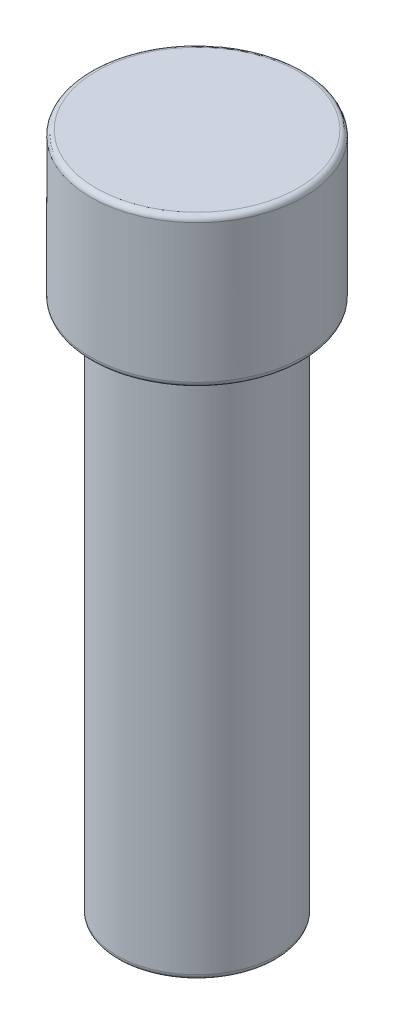
ISO-10303-21;
HEADER;
FILE_DESCRIPTION(('STEP AP214'),'2;1');
FILE_NAME('part.step','',(''),(''),'','','');
FILE_SCHEMA(('AUTOMOTIVE_DESIGN { 1 0 10303 214 1 1 1 1 }'));
ENDSEC;
DATA;
#1=APPLICATION_CONTEXT('core data for automotive mechanical design processes');
#2=APPLICATION_PROTOCOL_DEFINITION('international standard','automotive_design',2000,#1);
#3=PRODUCT_CONTEXT('',#1,'mechanical');
#4=PRODUCT('Part','Part','',(#3));
#5=PRODUCT_RELATED_PRODUCT_CATEGORY('part','',(#4));
#6=PRODUCT_DEFINITION_FORMATION('','',#4);
#7=PRODUCT_DEFINITION_CONTEXT('part definition',#1,'design');
#8=PRODUCT_DEFINITION('design','',#6,#7);
#9=PRODUCT_DEFINITION_SHAPE('','',#8);
#10=(LENGTH_UNIT() NAMED_UNIT(*) SI_UNIT(.MILLI.,.METRE.));
#11=(NAMED_UNIT(*) PLANE_ANGLE_UNIT() SI_UNIT($,.RADIAN.));
#12=(NAMED_UNIT(*) SI_UNIT($,.STERADIAN.) SOLID_ANGLE_UNIT());
#13=UNCERTAINTY_MEASURE_WITH_UNIT(LENGTH_MEASURE(1.E-05),#10,'distance_accuracy_value','');
#14=(GEOMETRIC_REPRESENTATION_CONTEXT(3) GLOBAL_UNCERTAINTY_ASSIGNED_CONTEXT((#13)) GLOBAL_UNIT_ASSIGNED_CONTEXT((#10,
#11,#12)) REPRESENTATION_CONTEXT('',''));
#15=CARTESIAN_POINT('',(0.,0.,0.));
#16=DIRECTION('',(0.,0.,1.));
#17=DIRECTION('',(1.,0.,0.));
#18=AXIS2_PLACEMENT_3D('',#15,#16,#17);
#19=CARTESIAN_POINT('',(0.,25.6,0.));
#20=DIRECTION('',(0.,1.,0.));
#21=DIRECTION('',(0.,0.,1.));
#22=AXIS2_PLACEMENT_3D('',#19,#20,#21);
#23=PLANE('',#22);
#24=CARTESIAN_POINT('',(0.,25.6,0.));
#25=DIRECTION('',(0.,1.,0.));
#26=DIRECTION('',(0.,0.,1.));
#27=AXIS2_PLACEMENT_3D('',#24,#25,#26);
#28=CIRCLE('',#27,3.8);
#29=CARTESIAN_POINT('',(0.,25.6,3.8));
#30=VERTEX_POINT('',#29);
#31=EDGE_CURVE('E11',#30,#30,#28,.T.);
#32=ORIENTED_EDGE('',*,*,#31,.T.);
#33=EDGE_LOOP('',(#32));
#34=FACE_BOUND('',#33,.T.);
#35=ADVANCED_FACE('F37',(#34),#23,.T.);
#36=CARTESIAN_POINT('',(0.,0.,0.));
#37=DIRECTION('',(0.,-1.,0.));
#38=DIRECTION('',(0.,0.,-1.));
#39=AXIS2_PLACEMENT_3D('',#36,#37,#38);
#40=CYLINDRICAL_SURFACE('',#39,4.);
#41=CARTESIAN_POINT('',(0.,20.2,0.));
#42=DIRECTION('',(0.,-1.,0.));
#43=DIRECTION('',(0.,0.,-1.));
#44=AXIS2_PLACEMENT_3D('',#41,#42,#43);
#45=CIRCLE('',#44,4.);
#46=CARTESIAN_POINT('',(0.,20.2,-4.));
#47=VERTEX_POINT('',#46);
#48=EDGE_CURVE('E71',#47,#47,#45,.F.);
#49=ORIENTED_EDGE('',*,*,#48,.T.);
#50=EDGE_LOOP('',(#49));
#51=FACE_BOUND('',#50,.T.);
#52=CARTESIAN_POINT('',(0.,25.4,0.));
#53=DIRECTION('',(0.,1.,0.));
#54=DIRECTION('',(0.,0.,1.));
#55=AXIS2_PLACEMENT_3D('',#52,#53,#54);
#56=CIRCLE('',#55,4.);
#57=CARTESIAN_POINT('',(0.,25.4,4.));
#58=VERTEX_POINT('',#57);
#59=EDGE_CURVE('E68',#58,#58,#56,.F.);
#60=ORIENTED_EDGE('',*,*,#59,.T.);
#61=EDGE_LOOP('',(#60));
#62=FACE_BOUND('',#61,.T.);
#63=ADVANCED_FACE('F101',(#51,#62),#40,.T.);
#64=CARTESIAN_POINT('',(4.,20.,0.));
#65=DIRECTION('',(0.,-1.,0.));
#66=DIRECTION('',(0.,0.,-1.));
#67=AXIS2_PLACEMENT_3D('',#64,#65,#66);
#68=PLANE('',#67);
#69=CARTESIAN_POINT('',(0.,20.,0.));
#70=DIRECTION('',(0.,-1.,0.));
#71=DIRECTION('',(0.,0.,-1.));
#72=AXIS2_PLACEMENT_3D('',#69,#70,#71);
#73=CIRCLE('',#72,3.8);
#74=CARTESIAN_POINT('',(0.,20.,-3.8));
#75=VERTEX_POINT('',#74);
#76=EDGE_CURVE('E61',#75,#75,#73,.T.);
#77=ORIENTED_EDGE('',*,*,#76,.T.);
#78=EDGE_LOOP('',(#77));
#79=FACE_BOUND('',#78,.T.);
#80=CARTESIAN_POINT('',(0.,20.,0.));
#81=DIRECTION('',(0.,-1.,0.));
#82=DIRECTION('',(0.,0.,-1.));
#83=AXIS2_PLACEMENT_3D('',#80,#81,#82);
#84=CIRCLE('',#83,3.);
#85=CARTESIAN_POINT('',(0.,20.,-3.));
#86=VERTEX_POINT('',#85);
#87=EDGE_CURVE('E57',#86,#86,#84,.T.);
#88=ORIENTED_EDGE('',*,*,#87,.F.);
#89=EDGE_LOOP('',(#88));
#90=FACE_BOUND('',#89,.T.);
#91=ADVANCED_FACE('F107',(#79,#90),#68,.T.);
#92=CARTESIAN_POINT('',(0.,0.,0.));
#93=DIRECTION('',(0.,-1.,0.));
#94=DIRECTION('',(0.,0.,-1.));
#95=AXIS2_PLACEMENT_3D('',#92,#93,#94);
#96=CYLINDRICAL_SURFACE('',#95,3.);
#97=CARTESIAN_POINT('',(0.,0.2,0.));
#98=DIRECTION('',(0.,-1.,0.));
#99=DIRECTION('',(0.,0.,-1.));
#100=AXIS2_PLACEMENT_3D('',#97,#98,#99);
#101=CIRCLE('',#100,3.);
#102=CARTESIAN_POINT('',(0.,0.2,-3.));
#103=VERTEX_POINT('',#102);
#104=EDGE_CURVE('E44',#103,#103,#101,.F.);
#105=ORIENTED_EDGE('',*,*,#104,.T.);
#106=EDGE_LOOP('',(#105));
#107=FACE_BOUND('',#106,.T.);
#108=ORIENTED_EDGE('',*,*,#87,.T.);
#109=EDGE_LOOP('',(#108));
#110=FACE_BOUND('',#109,.T.);
#111=ADVANCED_FACE('F79',(#107,#110),#96,.T.);
#112=CARTESIAN_POINT('',(3.,0.,0.));
#113=DIRECTION('',(0.,-1.,0.));
#114=DIRECTION('',(0.,0.,-1.));
#115=AXIS2_PLACEMENT_3D('',#112,#113,#114);
#116=PLANE('',#115);
#117=CARTESIAN_POINT('',(0.,0.,0.));
#118=DIRECTION('',(0.,-1.,0.));
#119=DIRECTION('',(0.,0.,-1.));
#120=AXIS2_PLACEMENT_3D('',#117,#118,#119);
#121=CIRCLE('',#120,2.8);
#122=CARTESIAN_POINT('',(0.,0.,-2.8));
#123=VERTEX_POINT('',#122);
#124=EDGE_CURVE('E74',#123,#123,#121,.T.);
#125=ORIENTED_EDGE('',*,*,#124,.T.);
#126=EDGE_LOOP('',(#125));
#127=FACE_BOUND('',#126,.T.);
#128=CARTESIAN_POINT('',(0.,0.,0.));
#129=DIRECTION('',(0.,-1.,0.));
#130=DIRECTION('',(0.,0.,-1.));
#131=AXIS2_PLACEMENT_3D('',#128,#129,#130);
#132=CIRCLE('',#131,1.02499999999999);
#133=CARTESIAN_POINT('',(0.,0.,-1.02499999999999));
#134=VERTEX_POINT('',#133);
#135=EDGE_CURVE('E58',#134,#134,#132,.T.);
#136=ORIENTED_EDGE('',*,*,#135,.F.);
#137=EDGE_LOOP('',(#136));
#138=FACE_BOUND('',#137,.T.);
#139=ADVANCED_FACE('F51',(#127,#138),#116,.T.);
#140=CARTESIAN_POINT('',(0.,9.25,0.));
#141=DIRECTION('',(0.,-1.,0.));
#142=DIRECTION('',(0.,0.,-1.));
#143=AXIS2_PLACEMENT_3D('',#140,#141,#142);
#144=CONICAL_SURFACE('',#143,1.025,1.02974425867665);
#145=CARTESIAN_POINT('',(0.,9.86588213450325,0.));
#146=VERTEX_POINT('',#145);
#147=VERTEX_LOOP('',#146);
#148=FACE_BOUND('',#147,.T.);
#149=CARTESIAN_POINT('',(0.,9.25,0.));
#150=DIRECTION('',(0.,-1.,0.));
#151=DIRECTION('',(0.,0.,-1.));
#152=AXIS2_PLACEMENT_3D('',#149,#150,#151);
#153=CIRCLE('',#152,1.025);
#154=CARTESIAN_POINT('',(0.,9.25,-1.025));
#155=VERTEX_POINT('',#154);
#156=EDGE_CURVE('E55',#155,#155,#153,.T.);
#157=ORIENTED_EDGE('',*,*,#156,.T.);
#158=EDGE_LOOP('',(#157));
#159=FACE_BOUND('',#158,.T.);
#160=ADVANCED_FACE('F47',(#148,#159),#144,.F.);
#161=CARTESIAN_POINT('',(0.,0.,0.));
#162=DIRECTION('',(0.,-1.,0.));
#163=DIRECTION('',(0.,0.,-1.));
#164=AXIS2_PLACEMENT_3D('',#161,#162,#163);
#165=CYLINDRICAL_SURFACE('',#164,1.02499999999999);
#166=ORIENTED_EDGE('',*,*,#156,.F.);
#167=EDGE_LOOP('',(#166));
#168=FACE_BOUND('',#167,.T.);
#169=ORIENTED_EDGE('',*,*,#135,.T.);
#170=EDGE_LOOP('',(#169));
#171=FACE_BOUND('',#170,.T.);
#172=ADVANCED_FACE('F50',(#168,#171),#165,.F.);
#173=CARTESIAN_POINT('',(0.,20.2,0.));
#174=DIRECTION('',(0.,-1.,0.));
#175=DIRECTION('',(0.,0.,-1.));
#176=AXIS2_PLACEMENT_3D('',#173,#174,#175);
#177=TOROIDAL_SURFACE('',#176,3.8,0.2);
#178=ORIENTED_EDGE('',*,*,#48,.F.);
#179=EDGE_LOOP('',(#178));
#180=FACE_BOUND('',#179,.T.);
#181=ORIENTED_EDGE('',*,*,#76,.F.);
#182=EDGE_LOOP('',(#181));
#183=FACE_BOUND('',#182,.T.);
#184=ADVANCED_FACE('F85',(#180,#183),#177,.T.);
#185=CARTESIAN_POINT('',(0.,0.2,0.));
#186=DIRECTION('',(0.,-1.,0.));
#187=DIRECTION('',(0.,0.,-1.));
#188=AXIS2_PLACEMENT_3D('',#185,#186,#187);
#189=TOROIDAL_SURFACE('',#188,2.8,0.2);
#190=ORIENTED_EDGE('',*,*,#104,.F.);
#191=EDGE_LOOP('',(#190));
#192=FACE_BOUND('',#191,.T.);
#193=ORIENTED_EDGE('',*,*,#124,.F.);
#194=EDGE_LOOP('',(#193));
#195=FACE_BOUND('',#194,.T.);
#196=ADVANCED_FACE('F82',(#192,#195),#189,.T.);
#197=CARTESIAN_POINT('',(0.,25.4,0.));
#198=DIRECTION('',(0.,1.,0.));
#199=DIRECTION('',(0.,0.,1.));
#200=AXIS2_PLACEMENT_3D('',#197,#198,#199);
#201=TOROIDAL_SURFACE('',#200,3.8,0.2);
#202=ORIENTED_EDGE('',*,*,#31,.F.);
#203=EDGE_LOOP('',(#202));
#204=FACE_BOUND('',#203,.T.);
#205=ORIENTED_EDGE('',*,*,#59,.F.);
#206=EDGE_LOOP('',(#205));
#207=FACE_BOUND('',#206,.T.);
#208=ADVANCED_FACE('F39',(#204,#207),#201,.T.);
#209=CLOSED_SHELL('',(#35,#63,#91,#111,#139,#160,#172,#184,#196,#208));
#210=MANIFOLD_SOLID_BREP('B2',#209);
#211=ADVANCED_BREP_SHAPE_REPRESENTATION('',(#18,#210),#14);
#212=SHAPE_DEFINITION_REPRESENTATION(#9,#211);
ENDSEC;
END-ISO-10303-21;
